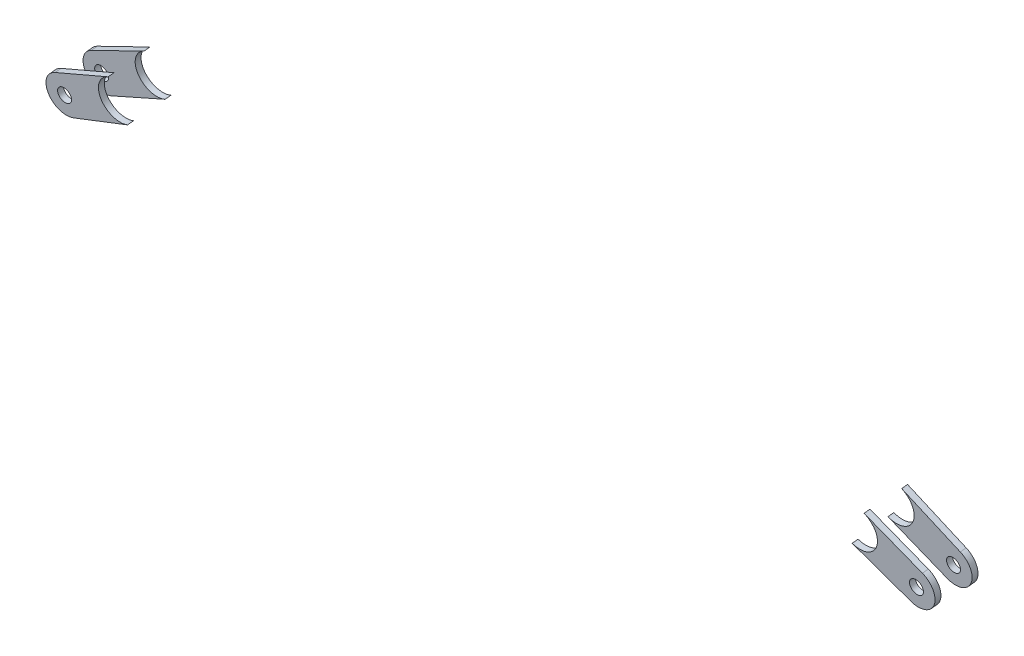
ISO-10303-21;
HEADER;
FILE_DESCRIPTION(('STEP AP214'),'2;1');
FILE_NAME('part.step','',(''),(''),'','','');
FILE_SCHEMA(('AUTOMOTIVE_DESIGN { 1 0 10303 214 1 1 1 1 }'));
ENDSEC;
DATA;
#1=APPLICATION_CONTEXT('core data for automotive mechanical design processes');
#2=APPLICATION_PROTOCOL_DEFINITION('international standard','automotive_design',2000,#1);
#3=PRODUCT_CONTEXT('',#1,'mechanical');
#4=PRODUCT('Part','Part','',(#3));
#5=PRODUCT_RELATED_PRODUCT_CATEGORY('part','',(#4));
#6=PRODUCT_DEFINITION_FORMATION('','',#4);
#7=PRODUCT_DEFINITION_CONTEXT('part definition',#1,'design');
#8=PRODUCT_DEFINITION('design','',#6,#7);
#9=PRODUCT_DEFINITION_SHAPE('','',#8);
#10=(LENGTH_UNIT() NAMED_UNIT(*) SI_UNIT(.MILLI.,.METRE.));
#11=(NAMED_UNIT(*) PLANE_ANGLE_UNIT() SI_UNIT($,.RADIAN.));
#12=(NAMED_UNIT(*) SI_UNIT($,.STERADIAN.) SOLID_ANGLE_UNIT());
#13=UNCERTAINTY_MEASURE_WITH_UNIT(LENGTH_MEASURE(1.E-05),#10,'distance_accuracy_value','');
#14=(GEOMETRIC_REPRESENTATION_CONTEXT(3) GLOBAL_UNCERTAINTY_ASSIGNED_CONTEXT((#13)) GLOBAL_UNIT_ASSIGNED_CONTEXT((#10,
#11,#12)) REPRESENTATION_CONTEXT('',''));
#15=CARTESIAN_POINT('',(0.,0.,0.));
#16=DIRECTION('',(0.,0.,1.));
#17=DIRECTION('',(1.,0.,0.));
#18=AXIS2_PLACEMENT_3D('',#15,#16,#17);
#19=CARTESIAN_POINT('',(-245.832565304354,-1934.21960279193,155.352155066702));
#20=DIRECTION('',(-0.459257110579023,0.883422561675354,0.0929918485974046));
#21=DIRECTION('',(0.88726720578764,0.461255791870188,0.));
#22=AXIS2_PLACEMENT_3D('',#19,#20,#21);
#23=PLANE('',#22);
#24=DIRECTION('',(0.88830338645229,0.456733700763768,0.0480772316593424));
#25=VECTOR('',#24,1.);
#26=CARTESIAN_POINT('',(-245.832565304354,-1934.62263921233,159.181001060449));
#27=LINE('',#26,#25);
#28=CARTESIAN_POINT('',(-281.922758684228,-1953.17892058541,157.227708284336));
#29=VERTEX_POINT('',#28);
#30=CARTESIAN_POINT('',(-245.832565304353,-1934.62263921233,159.181001060449));
#31=VERTEX_POINT('',#30);
#32=EDGE_CURVE('E97',#29,#31,#27,.T.);
#33=ORIENTED_EDGE('',*,*,#32,.T.);
#34=DIRECTION('',(0.,-0.104684784518041,0.994505452921406));
#35=VECTOR('',#34,1.);
#36=CARTESIAN_POINT('',(-245.832565304354,-1934.21960279193,155.352155066702));
#37=LINE('',#36,#35);
#38=CARTESIAN_POINT('',(-245.832565304353,-1934.21960279193,155.352155066702));
#39=VERTEX_POINT('',#38);
#40=EDGE_CURVE('E114',#39,#31,#37,.T.);
#41=ORIENTED_EDGE('',*,*,#40,.F.);
#42=DIRECTION('',(0.88830338645229,0.456733700763768,0.0480772316593424));
#43=VECTOR('',#42,1.);
#44=CARTESIAN_POINT('',(-245.832565304354,-1934.21960279193,155.352155066702));
#45=LINE('',#44,#43);
#46=CARTESIAN_POINT('',(-281.922758684228,-1952.77588416502,153.398862290588));
#47=VERTEX_POINT('',#46);
#48=EDGE_CURVE('E103',#47,#39,#45,.T.);
#49=ORIENTED_EDGE('',*,*,#48,.F.);
#50=DIRECTION('',(0.,-0.104684784518041,0.994505452921406));
#51=VECTOR('',#50,1.);
#52=CARTESIAN_POINT('',(-281.922758684228,-1952.77588416502,153.398862290588));
#53=LINE('',#52,#51);
#54=EDGE_CURVE('E90',#47,#29,#53,.T.);
#55=ORIENTED_EDGE('',*,*,#54,.T.);
#56=EDGE_LOOP('',(#33,#41,#49,#55));
#57=FACE_BOUND('',#56,.T.);
#58=ADVANCED_FACE('F48',(#57),#23,.T.);
#59=CARTESIAN_POINT('',(-276.411673357279,-1963.37695490512,152.282960107419));
#60=DIRECTION('',(0.,-0.104684784518041,0.994505452921406));
#61=DIRECTION('',(0.,-0.994505452921406,-0.104684784518041));
#62=AXIS2_PLACEMENT_3D('',#59,#60,#61);
#63=CYLINDRICAL_SURFACE('',#62,11.9999999999999);
#64=CARTESIAN_POINT('',(-276.411673357279,-1963.77999132551,156.111806101167));
#65=DIRECTION('',(0.,0.104684784518041,-0.994505452921406));
#66=DIRECTION('',(0.,0.994505452921406,0.104684784518041));
#67=AXIS2_PLACEMENT_3D('',#64,#65,#66);
#68=CIRCLE('',#67,11.9999999999999);
#69=CARTESIAN_POINT('',(-271.271068428686,-1974.56357592402,154.976691932903));
#70=VERTEX_POINT('',#69);
#71=EDGE_CURVE('E86',#70,#29,#68,.T.);
#72=ORIENTED_EDGE('',*,*,#71,.T.);
#73=ORIENTED_EDGE('',*,*,#54,.F.);
#74=CARTESIAN_POINT('',(-276.411673357279,-1963.37695490512,152.282960107419));
#75=DIRECTION('',(0.,0.104684784518041,-0.994505452921406));
#76=DIRECTION('',(0.,0.994505452921406,0.104684784518041));
#77=AXIS2_PLACEMENT_3D('',#74,#75,#76);
#78=CIRCLE('',#77,11.9999999999999);
#79=CARTESIAN_POINT('',(-271.271068428686,-1974.16053950363,151.147845939156));
#80=VERTEX_POINT('',#79);
#81=EDGE_CURVE('E105',#80,#47,#78,.T.);
#82=ORIENTED_EDGE('',*,*,#81,.F.);
#83=DIRECTION('',(0.,-0.104684784518041,0.994505452921406));
#84=VECTOR('',#83,1.);
#85=CARTESIAN_POINT('',(-271.271068428686,-1974.16053950363,151.147845939156));
#86=LINE('',#85,#84);
#87=EDGE_CURVE('E93',#80,#70,#86,.T.);
#88=ORIENTED_EDGE('',*,*,#87,.T.);
#89=EDGE_LOOP('',(#72,#73,#82,#88));
#90=FACE_BOUND('',#89,.T.);
#91=ADVANCED_FACE('F88',(#90),#63,.T.);
#92=CARTESIAN_POINT('',(-234.559526450571,-1956.85169635863,152.969829428103));
#93=DIRECTION('',(0.428383744049463,-0.898632049875464,-0.0945928473553109));
#94=DIRECTION('',(-0.902679625886656,-0.430313249864707,0.));
#95=AXIS2_PLACEMENT_3D('',#92,#93,#94);
#96=PLANE('',#95);
#97=DIRECTION('',(-0.903596905613429,-0.426029969400079,-0.04484525993685));
#98=VECTOR('',#97,1.);
#99=CARTESIAN_POINT('',(-234.559526450571,-1957.25473277903,156.79867542185));
#100=LINE('',#99,#98);
#101=CARTESIAN_POINT('',(-234.559526450571,-1957.25473277903,156.79867542185));
#102=VERTEX_POINT('',#101);
#103=EDGE_CURVE('E98',#102,#70,#100,.T.);
#104=ORIENTED_EDGE('',*,*,#103,.T.);
#105=ORIENTED_EDGE('',*,*,#87,.F.);
#106=DIRECTION('',(-0.903596905613429,-0.426029969400079,-0.04484525993685));
#107=VECTOR('',#106,1.);
#108=CARTESIAN_POINT('',(-234.559526450571,-1956.85169635863,152.969829428103));
#109=LINE('',#108,#107);
#110=CARTESIAN_POINT('',(-234.559526450572,-1956.85169635863,152.969829428103));
#111=VERTEX_POINT('',#110);
#112=EDGE_CURVE('E104',#111,#80,#109,.T.);
#113=ORIENTED_EDGE('',*,*,#112,.F.);
#114=DIRECTION('',(0.,-0.104684784518041,0.994505452921406));
#115=VECTOR('',#114,1.);
#116=CARTESIAN_POINT('',(-234.559526450571,-1956.85169635863,152.969829428103));
#117=LINE('',#116,#115);
#118=EDGE_CURVE('E58',#111,#102,#117,.T.);
#119=ORIENTED_EDGE('',*,*,#118,.T.);
#120=EDGE_LOOP('',(#104,#105,#113,#119));
#121=FACE_BOUND('',#120,.T.);
#122=ADVANCED_FACE('F128',(#121),#96,.T.);
#123=CARTESIAN_POINT('',(-276.411673357279,-1963.37695490512,152.282960107419));
#124=DIRECTION('',(0.,0.104684784518041,-0.994505452921406));
#125=DIRECTION('',(0.,0.994505452921406,0.104684784518041));
#126=AXIS2_PLACEMENT_3D('',#123,#124,#125);
#127=PLANE('',#126);
#128=CARTESIAN_POINT('',(-276.411673357279,-1963.37695490512,152.282960107419));
#129=DIRECTION('',(0.,0.104684784518041,-0.994505452921406));
#130=DIRECTION('',(0.,-0.994505452921406,-0.104684784518041));
#131=AXIS2_PLACEMENT_3D('',#128,#129,#130);
#132=CIRCLE('',#131,4.50000000000004);
#133=CARTESIAN_POINT('',(-276.411673357279,-1967.85222944327,151.811878577088));
#134=VERTEX_POINT('',#133);
#135=EDGE_CURVE('E119',#134,#134,#132,.T.);
#136=ORIENTED_EDGE('',*,*,#135,.F.);
#137=EDGE_LOOP('',(#136));
#138=FACE_BOUND('',#137,.T.);
#139=ORIENTED_EDGE('',*,*,#112,.T.);
#140=ORIENTED_EDGE('',*,*,#81,.T.);
#141=ORIENTED_EDGE('',*,*,#48,.T.);
#142=CARTESIAN_POINT('',(-240.,-1945.43906932521,154.171158589515));
#143=DIRECTION('',(0.,-0.104684784518041,0.994505452921406));
#144=DIRECTION('',(0.,0.994505452921406,0.104684784518041));
#145=AXIS2_PLACEMENT_3D('',#142,#143,#144);
#146=CIRCLE('',#145,12.7);
#147=EDGE_CURVE('E52',#111,#39,#146,.F.);
#148=ORIENTED_EDGE('',*,*,#147,.F.);
#149=EDGE_LOOP('',(#139,#140,#141,#148));
#150=FACE_BOUND('',#149,.T.);
#151=ADVANCED_FACE('F131',(#138,#150),#127,.T.);
#152=CARTESIAN_POINT('',(-276.411673357279,-1963.77999132551,156.111806101167));
#153=DIRECTION('',(0.,0.104684784518041,-0.994505452921406));
#154=DIRECTION('',(0.,0.994505452921406,0.104684784518041));
#155=AXIS2_PLACEMENT_3D('',#152,#153,#154);
#156=PLANE('',#155);
#157=CARTESIAN_POINT('',(-240.,-1945.84210574561,158.000004583262));
#158=DIRECTION('',(0.,-0.104684784518041,0.994505452921406));
#159=DIRECTION('',(0.,0.994505452921406,0.104684784518041));
#160=AXIS2_PLACEMENT_3D('',#157,#158,#159);
#161=CIRCLE('',#160,12.7);
#162=EDGE_CURVE('E12',#102,#31,#161,.F.);
#163=ORIENTED_EDGE('',*,*,#162,.T.);
#164=ORIENTED_EDGE('',*,*,#32,.F.);
#165=ORIENTED_EDGE('',*,*,#71,.F.);
#166=ORIENTED_EDGE('',*,*,#103,.F.);
#167=EDGE_LOOP('',(#163,#164,#165,#166));
#168=FACE_BOUND('',#167,.T.);
#169=CARTESIAN_POINT('',(-276.411673357279,-1963.77999132551,156.111806101167));
#170=DIRECTION('',(0.,0.104684784518041,-0.994505452921406));
#171=DIRECTION('',(0.,-0.994505452921406,-0.104684784518041));
#172=AXIS2_PLACEMENT_3D('',#169,#170,#171);
#173=CIRCLE('',#172,4.50000000000004);
#174=CARTESIAN_POINT('',(-276.411673357279,-1968.25526586366,155.640724570836));
#175=VERTEX_POINT('',#174);
#176=EDGE_CURVE('E109',#175,#175,#173,.T.);
#177=ORIENTED_EDGE('',*,*,#176,.T.);
#178=EDGE_LOOP('',(#177));
#179=FACE_BOUND('',#178,.T.);
#180=ADVANCED_FACE('F50',(#168,#179),#156,.F.);
#181=CARTESIAN_POINT('',(-276.411673357279,-1963.37695490512,152.282960107419));
#182=DIRECTION('',(0.,-0.104684784518041,0.994505452921406));
#183=DIRECTION('',(0.,-0.994505452921406,-0.104684784518041));
#184=AXIS2_PLACEMENT_3D('',#181,#182,#183);
#185=CYLINDRICAL_SURFACE('',#184,4.50000000000004);
#186=ORIENTED_EDGE('',*,*,#135,.T.);
#187=EDGE_LOOP('',(#186));
#188=FACE_BOUND('',#187,.T.);
#189=ORIENTED_EDGE('',*,*,#176,.F.);
#190=EDGE_LOOP('',(#189));
#191=FACE_BOUND('',#190,.T.);
#192=ADVANCED_FACE('F138',(#188,#191),#185,.F.);
#193=CARTESIAN_POINT('',(-240.,-1935.,55.0000000000017));
#194=DIRECTION('',(0.,-0.104684784518042,0.994505452921406));
#195=DIRECTION('',(0.,-0.994505452921406,-0.104684784518042));
#196=AXIS2_PLACEMENT_3D('',#193,#194,#195);
#197=CYLINDRICAL_SURFACE('',#196,12.7);
#198=ORIENTED_EDGE('',*,*,#118,.F.);
#199=ORIENTED_EDGE('',*,*,#147,.T.);
#200=ORIENTED_EDGE('',*,*,#40,.T.);
#201=ORIENTED_EDGE('',*,*,#162,.F.);
#202=EDGE_LOOP('',(#198,#199,#200,#201));
#203=FACE_BOUND('',#202,.T.);
#204=ADVANCED_FACE('F130',(#203),#197,.F.);
#205=CLOSED_SHELL('',(#58,#91,#122,#151,#180,#192,#204));
#206=MANIFOLD_SOLID_BREP('B2',#205);
#207=CARTESIAN_POINT('',(-276.411673357279,-1964.18302774591,180.162256511468));
#208=DIRECTION('',(0.,0.104684784518043,-0.994505452921406));
#209=DIRECTION('',(0.,0.994505452921406,0.104684784518043));
#210=AXIS2_PLACEMENT_3D('',#207,#208,#209);
#211=CYLINDRICAL_SURFACE('',#210,12.0000000000001);
#212=CARTESIAN_POINT('',(-276.411673357279,-1963.77999132552,176.333410517721));
#213=DIRECTION('',(0.,0.104684784518044,-0.994505452921406));
#214=DIRECTION('',(0.,-0.994505452921406,-0.104684784518044));
#215=AXIS2_PLACEMENT_3D('',#212,#213,#214);
#216=CIRCLE('',#215,12.0000000000001);
#217=CARTESIAN_POINT('',(-281.411887990994,-1952.93131548237,177.475376395947));
#218=VERTEX_POINT('',#217);
#219=CARTESIAN_POINT('',(-271.798802375048,-1974.79709298671,175.173715606016));
#220=VERTEX_POINT('',#219);
#221=EDGE_CURVE('E248',#218,#220,#216,.F.);
#222=ORIENTED_EDGE('',*,*,#221,.T.);
#223=DIRECTION('',(0.,0.104684784518043,-0.994505452921406));
#224=VECTOR('',#223,1.);
#225=CARTESIAN_POINT('',(-271.798802375048,-1975.2001294071,179.002561599763));
#226=LINE('',#225,#224);
#227=CARTESIAN_POINT('',(-271.798802375048,-1975.2001294071,179.002561599763));
#228=VERTEX_POINT('',#227);
#229=EDGE_CURVE('E256',#228,#220,#226,.T.);
#230=ORIENTED_EDGE('',*,*,#229,.F.);
#231=CARTESIAN_POINT('',(-276.411673357279,-1964.18302774591,180.162256511468));
#232=DIRECTION('',(0.,0.104684784518044,-0.994505452921406));
#233=DIRECTION('',(0.,-0.994505452921406,-0.104684784518044));
#234=AXIS2_PLACEMENT_3D('',#231,#232,#233);
#235=CIRCLE('',#234,12.0000000000001);
#236=CARTESIAN_POINT('',(-281.411887990994,-1953.33435190276,181.304222389694));
#237=VERTEX_POINT('',#236);
#238=EDGE_CURVE('E263',#237,#228,#235,.F.);
#239=ORIENTED_EDGE('',*,*,#238,.F.);
#240=DIRECTION('',(0.,0.104684784518043,-0.994505452921406));
#241=VECTOR('',#240,1.);
#242=CARTESIAN_POINT('',(-281.411887990994,-1953.33435190276,181.304222389694));
#243=LINE('',#242,#241);
#244=EDGE_CURVE('E267',#237,#218,#243,.T.);
#245=ORIENTED_EDGE('',*,*,#244,.T.);
#246=EDGE_LOOP('',(#222,#230,#239,#245));
#247=FACE_BOUND('',#246,.T.);
#248=ADVANCED_FACE('F205',(#247),#211,.T.);
#249=CARTESIAN_POINT('',(679.783628293864,-1515.16904520812,227.426886252288));
#250=DIRECTION('',(-0.416684552809572,0.904056320262516,0.0951638231855291));
#251=DIRECTION('',(0.908177972509983,0.418584245102054,0.));
#252=AXIS2_PLACEMENT_3D('',#249,#250,#251);
#253=PLANE('',#252);
#254=DIRECTION('',(-0.909051144573223,-0.414395059917237,-0.0436205326228665));
#255=VECTOR('',#254,1.);
#256=CARTESIAN_POINT('',(679.783628293864,-1514.76600878772,223.59804025854));
#257=LINE('',#256,#255);
#258=CARTESIAN_POINT('',(-245.291893820681,-1936.46585340383,179.208582930529));
#259=VERTEX_POINT('',#258);
#260=EDGE_CURVE('E269',#259,#218,#257,.T.);
#261=ORIENTED_EDGE('',*,*,#260,.T.);
#262=ORIENTED_EDGE('',*,*,#244,.F.);
#263=DIRECTION('',(-0.909051144573223,-0.414395059917237,-0.0436205326228665));
#264=VECTOR('',#263,1.);
#265=CARTESIAN_POINT('',(679.783628293864,-1515.16904520812,227.426886252288));
#266=LINE('',#265,#264);
#267=CARTESIAN_POINT('',(-245.291893820682,-1936.86888982423,183.037428924277));
#268=VERTEX_POINT('',#267);
#269=EDGE_CURVE('E262',#268,#237,#266,.T.);
#270=ORIENTED_EDGE('',*,*,#269,.F.);
#271=DIRECTION('',(0.,0.104684784518043,-0.994505452921406));
#272=VECTOR('',#271,1.);
#273=CARTESIAN_POINT('',(-245.291893820681,-1936.86888982423,183.037428924277));
#274=LINE('',#273,#272);
#275=EDGE_CURVE('E215',#268,#259,#274,.T.);
#276=ORIENTED_EDGE('',*,*,#275,.T.);
#277=EDGE_LOOP('',(#261,#262,#270,#276));
#278=FACE_BOUND('',#277,.T.);
#279=ADVANCED_FACE('F288',(#278),#253,.T.);
#280=CARTESIAN_POINT('',(-276.411673357279,-1964.18302774591,180.162256511468));
#281=DIRECTION('',(0.,0.104684784518043,-0.994505452921406));
#282=DIRECTION('',(0.,0.994505452921406,0.104684784518043));
#283=AXIS2_PLACEMENT_3D('',#280,#281,#282);
#284=CYLINDRICAL_SURFACE('',#283,4.49999999999997);
#285=CARTESIAN_POINT('',(-276.411673357279,-1964.18302774591,180.162256511468));
#286=DIRECTION('',(0.,0.104684784518044,-0.994505452921406));
#287=DIRECTION('',(0.,-0.994505452921406,-0.104684784518044));
#288=AXIS2_PLACEMENT_3D('',#285,#286,#287);
#289=CIRCLE('',#288,4.49999999999997);
#290=CARTESIAN_POINT('',(-276.411673357279,-1968.65830228406,179.691174981137));
#291=VERTEX_POINT('',#290);
#292=EDGE_CURVE('E253',#291,#291,#289,.T.);
#293=ORIENTED_EDGE('',*,*,#292,.F.);
#294=EDGE_LOOP('',(#293));
#295=FACE_BOUND('',#294,.T.);
#296=CARTESIAN_POINT('',(-276.411673357279,-1963.77999132552,176.333410517721));
#297=DIRECTION('',(0.,0.104684784518044,-0.994505452921406));
#298=DIRECTION('',(0.,-0.994505452921406,-0.104684784518044));
#299=AXIS2_PLACEMENT_3D('',#296,#297,#298);
#300=CIRCLE('',#299,4.49999999999997);
#301=CARTESIAN_POINT('',(-276.411673357279,-1968.25526586366,175.862328987389));
#302=VERTEX_POINT('',#301);
#303=EDGE_CURVE('E268',#302,#302,#300,.T.);
#304=ORIENTED_EDGE('',*,*,#303,.T.);
#305=EDGE_LOOP('',(#304));
#306=FACE_BOUND('',#305,.T.);
#307=ADVANCED_FACE('F290',(#295,#306),#284,.F.);
#308=CARTESIAN_POINT('',(650.274482990228,-1593.35810123341,219.196459302257));
#309=DIRECTION('',(-0.384405915185986,0.918091805099374,0.0966412426420405));
#310=DIRECTION('',(0.922409344465347,0.38621367303995,0.));
#311=AXIS2_PLACEMENT_3D('',#308,#309,#310);
#312=PLANE('',#311);
#313=DIRECTION('',(-0.923164174115322,-0.382293778787707,-0.0402414503987053));
#314=VECTOR('',#313,1.);
#315=CARTESIAN_POINT('',(650.274482990228,-1592.95506481302,215.367613308509));
#316=LINE('',#315,#314);
#317=CARTESIAN_POINT('',(-235.118044877138,-1959.60713459593,176.772658594519));
#318=VERTEX_POINT('',#317);
#319=EDGE_CURVE('E242',#318,#220,#316,.T.);
#320=ORIENTED_EDGE('',*,*,#319,.F.);
#321=DIRECTION('',(0.,0.104684784518043,-0.994505452921406));
#322=VECTOR('',#321,1.);
#323=CARTESIAN_POINT('',(-235.118044877138,-1960.01017101632,180.601504588267));
#324=LINE('',#323,#322);
#325=CARTESIAN_POINT('',(-235.118044877138,-1960.01017101632,180.601504588267));
#326=VERTEX_POINT('',#325);
#327=EDGE_CURVE('E252',#326,#318,#324,.T.);
#328=ORIENTED_EDGE('',*,*,#327,.F.);
#329=DIRECTION('',(-0.923164174115322,-0.382293778787707,-0.0402414503987053));
#330=VECTOR('',#329,1.);
#331=CARTESIAN_POINT('',(650.274482990228,-1593.35810123341,219.196459302257));
#332=LINE('',#331,#330);
#333=EDGE_CURVE('E258',#326,#228,#332,.T.);
#334=ORIENTED_EDGE('',*,*,#333,.T.);
#335=ORIENTED_EDGE('',*,*,#229,.T.);
#336=EDGE_LOOP('',(#320,#328,#334,#335));
#337=FACE_BOUND('',#336,.T.);
#338=ADVANCED_FACE('F257',(#337),#312,.F.);
#339=CARTESIAN_POINT('',(4.08845088515606E-13,-40.2819119408756,382.678163438315));
#340=DIRECTION('',(0.,-0.104684784518044,0.994505452921406));
#341=DIRECTION('',(0.,-0.994505452921406,-0.104684784518044));
#342=AXIS2_PLACEMENT_3D('',#339,#340,#341);
#343=PLANE('',#342);
#344=ORIENTED_EDGE('',*,*,#292,.T.);
#345=EDGE_LOOP('',(#344));
#346=FACE_BOUND('',#345,.T.);
#347=ORIENTED_EDGE('',*,*,#269,.T.);
#348=ORIENTED_EDGE('',*,*,#238,.T.);
#349=ORIENTED_EDGE('',*,*,#333,.F.);
#350=CARTESIAN_POINT('',(-240.,-1948.35040509156,181.828848369821));
#351=DIRECTION('',(0.,0.104684784518044,-0.994505452921406));
#352=DIRECTION('',(0.,-0.994505452921406,-0.104684784518044));
#353=AXIS2_PLACEMENT_3D('',#350,#351,#352);
#354=CIRCLE('',#353,12.7);
#355=EDGE_CURVE('E209',#268,#326,#354,.F.);
#356=ORIENTED_EDGE('',*,*,#355,.F.);
#357=EDGE_LOOP('',(#347,#348,#349,#356));
#358=FACE_BOUND('',#357,.T.);
#359=ADVANCED_FACE('F207',(#346,#358),#343,.T.);
#360=CARTESIAN_POINT('',(4.04427816231452E-13,-39.8788755204812,378.849317444568));
#361=DIRECTION('',(0.,-0.104684784518044,0.994505452921406));
#362=DIRECTION('',(0.,-0.994505452921406,-0.104684784518044));
#363=AXIS2_PLACEMENT_3D('',#360,#361,#362);
#364=PLANE('',#363);
#365=CARTESIAN_POINT('',(-240.,-1947.94736867117,178.000002376073));
#366=DIRECTION('',(0.,0.104684784518044,-0.994505452921406));
#367=DIRECTION('',(0.,-0.994505452921406,-0.104684784518044));
#368=AXIS2_PLACEMENT_3D('',#365,#366,#367);
#369=CIRCLE('',#368,12.7);
#370=EDGE_CURVE('E46',#259,#318,#369,.F.);
#371=ORIENTED_EDGE('',*,*,#370,.T.);
#372=ORIENTED_EDGE('',*,*,#319,.T.);
#373=ORIENTED_EDGE('',*,*,#221,.F.);
#374=ORIENTED_EDGE('',*,*,#260,.F.);
#375=EDGE_LOOP('',(#371,#372,#373,#374));
#376=FACE_BOUND('',#375,.T.);
#377=ORIENTED_EDGE('',*,*,#303,.F.);
#378=EDGE_LOOP('',(#377));
#379=FACE_BOUND('',#378,.T.);
#380=ADVANCED_FACE('F244',(#376,#379),#364,.F.);
#381=CARTESIAN_POINT('',(-240.,-1935.,55.0000000000017));
#382=DIRECTION('',(0.,-0.104684784518042,0.994505452921406));
#383=DIRECTION('',(0.,-0.994505452921406,-0.104684784518042));
#384=AXIS2_PLACEMENT_3D('',#381,#382,#383);
#385=CYLINDRICAL_SURFACE('',#384,12.7);
#386=ORIENTED_EDGE('',*,*,#275,.F.);
#387=ORIENTED_EDGE('',*,*,#355,.T.);
#388=ORIENTED_EDGE('',*,*,#327,.T.);
#389=ORIENTED_EDGE('',*,*,#370,.F.);
#390=EDGE_LOOP('',(#386,#387,#388,#389));
#391=FACE_BOUND('',#390,.T.);
#392=ADVANCED_FACE('F285',(#391),#385,.F.);
#393=CLOSED_SHELL('',(#248,#279,#307,#338,#359,#380,#392));
#394=MANIFOLD_SOLID_BREP('B6',#393);
#395=CARTESIAN_POINT('',(245.832565304354,-1934.21960279193,155.352155066702));
#396=DIRECTION('',(0.459257110579023,0.883422561675354,0.0929918485974046));
#397=DIRECTION('',(-0.88726720578764,0.461255791870188,0.));
#398=AXIS2_PLACEMENT_3D('',#395,#396,#397);
#399=PLANE('',#398);
#400=DIRECTION('',(-0.88830338645229,0.456733700763768,0.0480772316593424));
#401=VECTOR('',#400,1.);
#402=CARTESIAN_POINT('',(245.832565304354,-1934.62263921233,159.181001060449));
#403=LINE('',#402,#401);
#404=CARTESIAN_POINT('',(281.922758684228,-1953.17892058541,157.227708284336));
#405=VERTEX_POINT('',#404);
#406=CARTESIAN_POINT('',(245.832565304353,-1934.62263921233,159.181001060449));
#407=VERTEX_POINT('',#406);
#408=EDGE_CURVE('E415',#405,#407,#403,.T.);
#409=ORIENTED_EDGE('',*,*,#408,.F.);
#410=DIRECTION('',(0.,-0.104684784518041,0.994505452921406));
#411=VECTOR('',#410,1.);
#412=CARTESIAN_POINT('',(281.922758684228,-1952.77588416502,153.398862290588));
#413=LINE('',#412,#411);
#414=CARTESIAN_POINT('',(281.922758684228,-1952.77588416502,153.398862290588));
#415=VERTEX_POINT('',#414);
#416=EDGE_CURVE('E398',#415,#405,#413,.T.);
#417=ORIENTED_EDGE('',*,*,#416,.F.);
#418=DIRECTION('',(-0.88830338645229,0.456733700763768,0.0480772316593424));
#419=VECTOR('',#418,1.);
#420=CARTESIAN_POINT('',(245.832565304354,-1934.21960279193,155.352155066702));
#421=LINE('',#420,#419);
#422=CARTESIAN_POINT('',(245.832565304353,-1934.21960279193,155.352155066702));
#423=VERTEX_POINT('',#422);
#424=EDGE_CURVE('E428',#415,#423,#421,.T.);
#425=ORIENTED_EDGE('',*,*,#424,.T.);
#426=DIRECTION('',(0.,-0.104684784518041,0.994505452921406));
#427=VECTOR('',#426,1.);
#428=CARTESIAN_POINT('',(245.832565304354,-1934.21960279193,155.352155066702));
#429=LINE('',#428,#427);
#430=EDGE_CURVE('E420',#423,#407,#429,.T.);
#431=ORIENTED_EDGE('',*,*,#430,.T.);
#432=EDGE_LOOP('',(#409,#417,#425,#431));
#433=FACE_BOUND('',#432,.T.);
#434=ADVANCED_FACE('F361',(#433),#399,.T.);
#435=CARTESIAN_POINT('',(276.411673357279,-1963.37695490512,152.282960107419));
#436=DIRECTION('',(0.,-0.104684784518041,0.994505452921406));
#437=DIRECTION('',(0.,-0.994505452921406,-0.104684784518041));
#438=AXIS2_PLACEMENT_3D('',#435,#436,#437);
#439=CYLINDRICAL_SURFACE('',#438,11.9999999999999);
#440=CARTESIAN_POINT('',(276.411673357279,-1963.77999132551,156.111806101167));
#441=DIRECTION('',(0.,-0.104684784518041,0.994505452921406));
#442=DIRECTION('',(0.,0.994505452921406,0.104684784518041));
#443=AXIS2_PLACEMENT_3D('',#440,#441,#442);
#444=CIRCLE('',#443,11.9999999999999);
#445=CARTESIAN_POINT('',(271.271068428686,-1974.56357592402,154.976691932903));
#446=VERTEX_POINT('',#445);
#447=EDGE_CURVE('E401',#446,#405,#444,.T.);
#448=ORIENTED_EDGE('',*,*,#447,.F.);
#449=DIRECTION('',(0.,-0.104684784518041,0.994505452921406));
#450=VECTOR('',#449,1.);
#451=CARTESIAN_POINT('',(271.271068428686,-1974.16053950363,151.147845939156));
#452=LINE('',#451,#450);
#453=CARTESIAN_POINT('',(271.271068428686,-1974.16053950363,151.147845939156));
#454=VERTEX_POINT('',#453);
#455=EDGE_CURVE('E432',#454,#446,#452,.T.);
#456=ORIENTED_EDGE('',*,*,#455,.F.);
#457=CARTESIAN_POINT('',(276.411673357279,-1963.37695490512,152.282960107419));
#458=DIRECTION('',(0.,-0.104684784518041,0.994505452921406));
#459=DIRECTION('',(0.,0.994505452921406,0.104684784518041));
#460=AXIS2_PLACEMENT_3D('',#457,#458,#459);
#461=CIRCLE('',#460,11.9999999999999);
#462=EDGE_CURVE('E404',#454,#415,#461,.T.);
#463=ORIENTED_EDGE('',*,*,#462,.T.);
#464=ORIENTED_EDGE('',*,*,#416,.T.);
#465=EDGE_LOOP('',(#448,#456,#463,#464));
#466=FACE_BOUND('',#465,.T.);
#467=ADVANCED_FACE('F400',(#466),#439,.T.);
#468=CARTESIAN_POINT('',(234.559526450571,-1956.85169635863,152.969829428103));
#469=DIRECTION('',(-0.428383744049463,-0.898632049875464,-0.0945928473553109));
#470=DIRECTION('',(0.902679625886656,-0.430313249864707,0.));
#471=AXIS2_PLACEMENT_3D('',#468,#469,#470);
#472=PLANE('',#471);
#473=DIRECTION('',(0.903596905613429,-0.426029969400079,-0.04484525993685));
#474=VECTOR('',#473,1.);
#475=CARTESIAN_POINT('',(234.559526450571,-1957.25473277903,156.79867542185));
#476=LINE('',#475,#474);
#477=CARTESIAN_POINT('',(234.559526450571,-1957.25473277903,156.79867542185));
#478=VERTEX_POINT('',#477);
#479=EDGE_CURVE('E417',#478,#446,#476,.T.);
#480=ORIENTED_EDGE('',*,*,#479,.F.);
#481=DIRECTION('',(0.,-0.104684784518041,0.994505452921406));
#482=VECTOR('',#481,1.);
#483=CARTESIAN_POINT('',(234.559526450571,-1956.85169635863,152.969829428103));
#484=LINE('',#483,#482);
#485=CARTESIAN_POINT('',(234.559526450572,-1956.85169635863,152.969829428103));
#486=VERTEX_POINT('',#485);
#487=EDGE_CURVE('E371',#486,#478,#484,.T.);
#488=ORIENTED_EDGE('',*,*,#487,.F.);
#489=DIRECTION('',(0.903596905613429,-0.426029969400079,-0.04484525993685));
#490=VECTOR('',#489,1.);
#491=CARTESIAN_POINT('',(234.559526450571,-1956.85169635863,152.969829428103));
#492=LINE('',#491,#490);
#493=EDGE_CURVE('E409',#486,#454,#492,.T.);
#494=ORIENTED_EDGE('',*,*,#493,.T.);
#495=ORIENTED_EDGE('',*,*,#455,.T.);
#496=EDGE_LOOP('',(#480,#488,#494,#495));
#497=FACE_BOUND('',#496,.T.);
#498=ADVANCED_FACE('F442',(#497),#472,.T.);
#499=CARTESIAN_POINT('',(276.411673357279,-1963.37695490512,152.282960107419));
#500=DIRECTION('',(0.,0.104684784518041,-0.994505452921406));
#501=DIRECTION('',(0.,0.994505452921406,0.104684784518041));
#502=AXIS2_PLACEMENT_3D('',#499,#500,#501);
#503=PLANE('',#502);
#504=CARTESIAN_POINT('',(276.411673357279,-1963.37695490512,152.282960107419));
#505=DIRECTION('',(0.,-0.104684784518041,0.994505452921406));
#506=DIRECTION('',(0.,-0.994505452921406,-0.104684784518041));
#507=AXIS2_PLACEMENT_3D('',#504,#505,#506);
#508=CIRCLE('',#507,4.50000000000004);
#509=CARTESIAN_POINT('',(276.411673357279,-1967.85222944327,151.811878577088));
#510=VERTEX_POINT('',#509);
#511=EDGE_CURVE('E433',#510,#510,#508,.T.);
#512=ORIENTED_EDGE('',*,*,#511,.T.);
#513=EDGE_LOOP('',(#512));
#514=FACE_BOUND('',#513,.T.);
#515=ORIENTED_EDGE('',*,*,#493,.F.);
#516=CARTESIAN_POINT('',(240.,-1945.43906932521,154.171158589515));
#517=DIRECTION('',(0.,0.104684784518041,-0.994505452921406));
#518=DIRECTION('',(0.,0.994505452921406,0.104684784518041));
#519=AXIS2_PLACEMENT_3D('',#516,#517,#518);
#520=CIRCLE('',#519,12.7);
#521=EDGE_CURVE('E365',#486,#423,#520,.F.);
#522=ORIENTED_EDGE('',*,*,#521,.T.);
#523=ORIENTED_EDGE('',*,*,#424,.F.);
#524=ORIENTED_EDGE('',*,*,#462,.F.);
#525=EDGE_LOOP('',(#515,#522,#523,#524));
#526=FACE_BOUND('',#525,.T.);
#527=ADVANCED_FACE('F444',(#514,#526),#503,.T.);
#528=CARTESIAN_POINT('',(276.411673357279,-1963.77999132551,156.111806101167));
#529=DIRECTION('',(0.,0.104684784518041,-0.994505452921406));
#530=DIRECTION('',(0.,0.994505452921406,0.104684784518041));
#531=AXIS2_PLACEMENT_3D('',#528,#529,#530);
#532=PLANE('',#531);
#533=CARTESIAN_POINT('',(240.,-1945.84210574561,158.000004583262));
#534=DIRECTION('',(0.,0.104684784518041,-0.994505452921406));
#535=DIRECTION('',(0.,0.994505452921406,0.104684784518041));
#536=AXIS2_PLACEMENT_3D('',#533,#534,#535);
#537=CIRCLE('',#536,12.7);
#538=EDGE_CURVE('E203',#478,#407,#537,.F.);
#539=ORIENTED_EDGE('',*,*,#538,.F.);
#540=ORIENTED_EDGE('',*,*,#479,.T.);
#541=ORIENTED_EDGE('',*,*,#447,.T.);
#542=ORIENTED_EDGE('',*,*,#408,.T.);
#543=EDGE_LOOP('',(#539,#540,#541,#542));
#544=FACE_BOUND('',#543,.T.);
#545=CARTESIAN_POINT('',(276.411673357279,-1963.77999132551,156.111806101167));
#546=DIRECTION('',(0.,-0.104684784518041,0.994505452921406));
#547=DIRECTION('',(0.,-0.994505452921406,-0.104684784518041));
#548=AXIS2_PLACEMENT_3D('',#545,#546,#547);
#549=CIRCLE('',#548,4.50000000000004);
#550=CARTESIAN_POINT('',(276.411673357279,-1968.25526586366,155.640724570836));
#551=VERTEX_POINT('',#550);
#552=EDGE_CURVE('E421',#551,#551,#549,.T.);
#553=ORIENTED_EDGE('',*,*,#552,.F.);
#554=EDGE_LOOP('',(#553));
#555=FACE_BOUND('',#554,.T.);
#556=ADVANCED_FACE('F363',(#544,#555),#532,.F.);
#557=CARTESIAN_POINT('',(276.411673357279,-1963.37695490512,152.282960107419));
#558=DIRECTION('',(0.,-0.104684784518041,0.994505452921406));
#559=DIRECTION('',(0.,-0.994505452921406,-0.104684784518041));
#560=AXIS2_PLACEMENT_3D('',#557,#558,#559);
#561=CYLINDRICAL_SURFACE('',#560,4.50000000000004);
#562=ORIENTED_EDGE('',*,*,#511,.F.);
#563=EDGE_LOOP('',(#562));
#564=FACE_BOUND('',#563,.T.);
#565=ORIENTED_EDGE('',*,*,#552,.T.);
#566=EDGE_LOOP('',(#565));
#567=FACE_BOUND('',#566,.T.);
#568=ADVANCED_FACE('F456',(#564,#567),#561,.F.);
#569=CARTESIAN_POINT('',(240.,-1935.,55.0000000000017));
#570=DIRECTION('',(0.,-0.104684784518042,0.994505452921406));
#571=DIRECTION('',(0.,-0.994505452921406,-0.104684784518042));
#572=AXIS2_PLACEMENT_3D('',#569,#570,#571);
#573=CYLINDRICAL_SURFACE('',#572,12.7);
#574=ORIENTED_EDGE('',*,*,#487,.T.);
#575=ORIENTED_EDGE('',*,*,#538,.T.);
#576=ORIENTED_EDGE('',*,*,#430,.F.);
#577=ORIENTED_EDGE('',*,*,#521,.F.);
#578=EDGE_LOOP('',(#574,#575,#576,#577));
#579=FACE_BOUND('',#578,.T.);
#580=ADVANCED_FACE('F440',(#579),#573,.F.);
#581=CLOSED_SHELL('',(#434,#467,#498,#527,#556,#568,#580));
#582=MANIFOLD_SOLID_BREP('B40',#581);
#583=CARTESIAN_POINT('',(276.411673357279,-1964.18302774591,180.162256511468));
#584=DIRECTION('',(0.,0.104684784518043,-0.994505452921406));
#585=DIRECTION('',(0.,0.994505452921406,0.104684784518043));
#586=AXIS2_PLACEMENT_3D('',#583,#584,#585);
#587=CYLINDRICAL_SURFACE('',#586,12.0000000000001);
#588=CARTESIAN_POINT('',(276.411673357279,-1963.77999132552,176.333410517721));
#589=DIRECTION('',(0.,-0.104684784518044,0.994505452921406));
#590=DIRECTION('',(0.,-0.994505452921406,-0.104684784518044));
#591=AXIS2_PLACEMENT_3D('',#588,#589,#590);
#592=CIRCLE('',#591,12.0000000000001);
#593=CARTESIAN_POINT('',(281.411887990994,-1952.93131548237,177.475376395947));
#594=VERTEX_POINT('',#593);
#595=CARTESIAN_POINT('',(271.798802375048,-1974.79709298671,175.173715606016));
#596=VERTEX_POINT('',#595);
#597=EDGE_CURVE('E549',#594,#596,#592,.F.);
#598=ORIENTED_EDGE('',*,*,#597,.F.);
#599=DIRECTION('',(0.,0.104684784518043,-0.994505452921406));
#600=VECTOR('',#599,1.);
#601=CARTESIAN_POINT('',(281.411887990994,-1953.33435190276,181.304222389694));
#602=LINE('',#601,#600);
#603=CARTESIAN_POINT('',(281.411887990994,-1953.33435190276,181.304222389694));
#604=VERTEX_POINT('',#603);
#605=EDGE_CURVE('E580',#604,#594,#602,.T.);
#606=ORIENTED_EDGE('',*,*,#605,.F.);
#607=CARTESIAN_POINT('',(276.411673357279,-1964.18302774591,180.162256511468));
#608=DIRECTION('',(0.,-0.104684784518044,0.994505452921406));
#609=DIRECTION('',(0.,-0.994505452921406,-0.104684784518044));
#610=AXIS2_PLACEMENT_3D('',#607,#608,#609);
#611=CIRCLE('',#610,12.0000000000001);
#612=CARTESIAN_POINT('',(271.798802375048,-1975.2001294071,179.002561599763));
#613=VERTEX_POINT('',#612);
#614=EDGE_CURVE('E552',#604,#613,#611,.F.);
#615=ORIENTED_EDGE('',*,*,#614,.T.);
#616=DIRECTION('',(0.,0.104684784518043,-0.994505452921406));
#617=VECTOR('',#616,1.);
#618=CARTESIAN_POINT('',(271.798802375048,-1975.2001294071,179.002561599763));
#619=LINE('',#618,#617);
#620=EDGE_CURVE('E546',#613,#596,#619,.T.);
#621=ORIENTED_EDGE('',*,*,#620,.T.);
#622=EDGE_LOOP('',(#598,#606,#615,#621));
#623=FACE_BOUND('',#622,.T.);
#624=ADVANCED_FACE('F508',(#623),#587,.T.);
#625=CARTESIAN_POINT('',(-679.783628293864,-1515.16904520812,227.426886252288));
#626=DIRECTION('',(0.416684552809572,0.904056320262516,0.0951638231855291));
#627=DIRECTION('',(-0.908177972509983,0.418584245102054,0.));
#628=AXIS2_PLACEMENT_3D('',#625,#626,#627);
#629=PLANE('',#628);
#630=DIRECTION('',(0.909051144573223,-0.414395059917237,-0.0436205326228665));
#631=VECTOR('',#630,1.);
#632=CARTESIAN_POINT('',(-679.783628293864,-1514.76600878772,223.59804025854));
#633=LINE('',#632,#631);
#634=CARTESIAN_POINT('',(245.291893820681,-1936.46585340383,179.208582930529));
#635=VERTEX_POINT('',#634);
#636=EDGE_CURVE('E569',#635,#594,#633,.T.);
#637=ORIENTED_EDGE('',*,*,#636,.F.);
#638=DIRECTION('',(0.,0.104684784518043,-0.994505452921406));
#639=VECTOR('',#638,1.);
#640=CARTESIAN_POINT('',(245.291893820681,-1936.86888982423,183.037428924277));
#641=LINE('',#640,#639);
#642=CARTESIAN_POINT('',(245.291893820682,-1936.86888982423,183.037428924277));
#643=VERTEX_POINT('',#642);
#644=EDGE_CURVE('E518',#643,#635,#641,.T.);
#645=ORIENTED_EDGE('',*,*,#644,.F.);
#646=DIRECTION('',(0.909051144573223,-0.414395059917237,-0.0436205326228665));
#647=VECTOR('',#646,1.);
#648=CARTESIAN_POINT('',(-679.783628293864,-1515.16904520812,227.426886252288));
#649=LINE('',#648,#647);
#650=EDGE_CURVE('E555',#643,#604,#649,.T.);
#651=ORIENTED_EDGE('',*,*,#650,.T.);
#652=ORIENTED_EDGE('',*,*,#605,.T.);
#653=EDGE_LOOP('',(#637,#645,#651,#652));
#654=FACE_BOUND('',#653,.T.);
#655=ADVANCED_FACE('F590',(#654),#629,.T.);
#656=CARTESIAN_POINT('',(276.411673357279,-1964.18302774591,180.162256511468));
#657=DIRECTION('',(0.,0.104684784518043,-0.994505452921406));
#658=DIRECTION('',(0.,0.994505452921406,0.104684784518043));
#659=AXIS2_PLACEMENT_3D('',#656,#657,#658);
#660=CYLINDRICAL_SURFACE('',#659,4.49999999999997);
#661=CARTESIAN_POINT('',(276.411673357279,-1964.18302774591,180.162256511468));
#662=DIRECTION('',(0.,-0.104684784518044,0.994505452921406));
#663=DIRECTION('',(0.,-0.994505452921406,-0.104684784518044));
#664=AXIS2_PLACEMENT_3D('',#661,#662,#663);
#665=CIRCLE('',#664,4.49999999999997);
#666=CARTESIAN_POINT('',(276.411673357279,-1968.65830228406,179.691174981137));
#667=VERTEX_POINT('',#666);
#668=EDGE_CURVE('E564',#667,#667,#665,.T.);
#669=ORIENTED_EDGE('',*,*,#668,.T.);
#670=EDGE_LOOP('',(#669));
#671=FACE_BOUND('',#670,.T.);
#672=CARTESIAN_POINT('',(276.411673357279,-1963.77999132552,176.333410517721));
#673=DIRECTION('',(0.,-0.104684784518044,0.994505452921406));
#674=DIRECTION('',(0.,-0.994505452921406,-0.104684784518044));
#675=AXIS2_PLACEMENT_3D('',#672,#673,#674);
#676=CIRCLE('',#675,4.49999999999997);
#677=CARTESIAN_POINT('',(276.411673357279,-1968.25526586366,175.862328987389));
#678=VERTEX_POINT('',#677);
#679=EDGE_CURVE('E570',#678,#678,#676,.T.);
#680=ORIENTED_EDGE('',*,*,#679,.F.);
#681=EDGE_LOOP('',(#680));
#682=FACE_BOUND('',#681,.T.);
#683=ADVANCED_FACE('F603',(#671,#682),#660,.F.);
#684=CARTESIAN_POINT('',(-650.274482990228,-1593.35810123341,219.196459302257));
#685=DIRECTION('',(0.384405915185986,0.918091805099374,0.0966412426420405));
#686=DIRECTION('',(-0.922409344465347,0.38621367303995,0.));
#687=AXIS2_PLACEMENT_3D('',#684,#685,#686);
#688=PLANE('',#687);
#689=DIRECTION('',(0.923164174115322,-0.382293778787707,-0.0402414503987053));
#690=VECTOR('',#689,1.);
#691=CARTESIAN_POINT('',(-650.274482990228,-1592.95506481302,215.367613308509));
#692=LINE('',#691,#690);
#693=CARTESIAN_POINT('',(235.118044877138,-1959.60713459593,176.772658594519));
#694=VERTEX_POINT('',#693);
#695=EDGE_CURVE('E559',#694,#596,#692,.T.);
#696=ORIENTED_EDGE('',*,*,#695,.T.);
#697=ORIENTED_EDGE('',*,*,#620,.F.);
#698=DIRECTION('',(0.923164174115322,-0.382293778787707,-0.0402414503987053));
#699=VECTOR('',#698,1.);
#700=CARTESIAN_POINT('',(-650.274482990228,-1593.35810123341,219.196459302257));
#701=LINE('',#700,#699);
#702=CARTESIAN_POINT('',(235.118044877138,-1960.01017101632,180.601504588267));
#703=VERTEX_POINT('',#702);
#704=EDGE_CURVE('E574',#703,#613,#701,.T.);
#705=ORIENTED_EDGE('',*,*,#704,.F.);
#706=DIRECTION('',(0.,0.104684784518043,-0.994505452921406));
#707=VECTOR('',#706,1.);
#708=CARTESIAN_POINT('',(235.118044877138,-1960.01017101632,180.601504588267));
#709=LINE('',#708,#707);
#710=EDGE_CURVE('E561',#703,#694,#709,.T.);
#711=ORIENTED_EDGE('',*,*,#710,.T.);
#712=EDGE_LOOP('',(#696,#697,#705,#711));
#713=FACE_BOUND('',#712,.T.);
#714=ADVANCED_FACE('F560',(#713),#688,.F.);
#715=CARTESIAN_POINT('',(-4.08845088515606E-13,-40.2819119408756,382.678163438315));
#716=DIRECTION('',(0.,-0.104684784518044,0.994505452921406));
#717=DIRECTION('',(0.,-0.994505452921406,-0.104684784518044));
#718=AXIS2_PLACEMENT_3D('',#715,#716,#717);
#719=PLANE('',#718);
#720=ORIENTED_EDGE('',*,*,#668,.F.);
#721=EDGE_LOOP('',(#720));
#722=FACE_BOUND('',#721,.T.);
#723=ORIENTED_EDGE('',*,*,#650,.F.);
#724=CARTESIAN_POINT('',(240.,-1948.35040509156,181.828848369821));
#725=DIRECTION('',(0.,-0.104684784518044,0.994505452921406));
#726=DIRECTION('',(0.,-0.994505452921406,-0.104684784518044));
#727=AXIS2_PLACEMENT_3D('',#724,#725,#726);
#728=CIRCLE('',#727,12.7);
#729=EDGE_CURVE('E512',#643,#703,#728,.F.);
#730=ORIENTED_EDGE('',*,*,#729,.T.);
#731=ORIENTED_EDGE('',*,*,#704,.T.);
#732=ORIENTED_EDGE('',*,*,#614,.F.);
#733=EDGE_LOOP('',(#723,#730,#731,#732));
#734=FACE_BOUND('',#733,.T.);
#735=ADVANCED_FACE('F510',(#722,#734),#719,.T.);
#736=CARTESIAN_POINT('',(-4.04427816231452E-13,-39.8788755204812,378.849317444568));
#737=DIRECTION('',(0.,-0.104684784518044,0.994505452921406));
#738=DIRECTION('',(0.,-0.994505452921406,-0.104684784518044));
#739=AXIS2_PLACEMENT_3D('',#736,#737,#738);
#740=PLANE('',#739);
#741=CARTESIAN_POINT('',(240.,-1947.94736867117,178.000002376073));
#742=DIRECTION('',(0.,-0.104684784518044,0.994505452921406));
#743=DIRECTION('',(0.,-0.994505452921406,-0.104684784518044));
#744=AXIS2_PLACEMENT_3D('',#741,#742,#743);
#745=CIRCLE('',#744,12.7);
#746=EDGE_CURVE('E359',#635,#694,#745,.F.);
#747=ORIENTED_EDGE('',*,*,#746,.F.);
#748=ORIENTED_EDGE('',*,*,#636,.T.);
#749=ORIENTED_EDGE('',*,*,#597,.T.);
#750=ORIENTED_EDGE('',*,*,#695,.F.);
#751=EDGE_LOOP('',(#747,#748,#749,#750));
#752=FACE_BOUND('',#751,.T.);
#753=ORIENTED_EDGE('',*,*,#679,.T.);
#754=EDGE_LOOP('',(#753));
#755=FACE_BOUND('',#754,.T.);
#756=ADVANCED_FACE('F566',(#752,#755),#740,.F.);
#757=CARTESIAN_POINT('',(240.,-1935.,55.0000000000017));
#758=DIRECTION('',(0.,-0.104684784518042,0.994505452921406));
#759=DIRECTION('',(0.,-0.994505452921406,-0.104684784518042));
#760=AXIS2_PLACEMENT_3D('',#757,#758,#759);
#761=CYLINDRICAL_SURFACE('',#760,12.7);
#762=ORIENTED_EDGE('',*,*,#644,.T.);
#763=ORIENTED_EDGE('',*,*,#746,.T.);
#764=ORIENTED_EDGE('',*,*,#710,.F.);
#765=ORIENTED_EDGE('',*,*,#729,.F.);
#766=EDGE_LOOP('',(#762,#763,#764,#765));
#767=FACE_BOUND('',#766,.T.);
#768=ADVANCED_FACE('F591',(#767),#761,.F.);
#769=CLOSED_SHELL('',(#624,#655,#683,#714,#735,#756,#768));
#770=MANIFOLD_SOLID_BREP('B197',#769);
#771=ADVANCED_BREP_SHAPE_REPRESENTATION('',(#18,#206,#394,#582,#770),#14);
#772=SHAPE_DEFINITION_REPRESENTATION(#9,#771);
ENDSEC;
END-ISO-10303-21;
